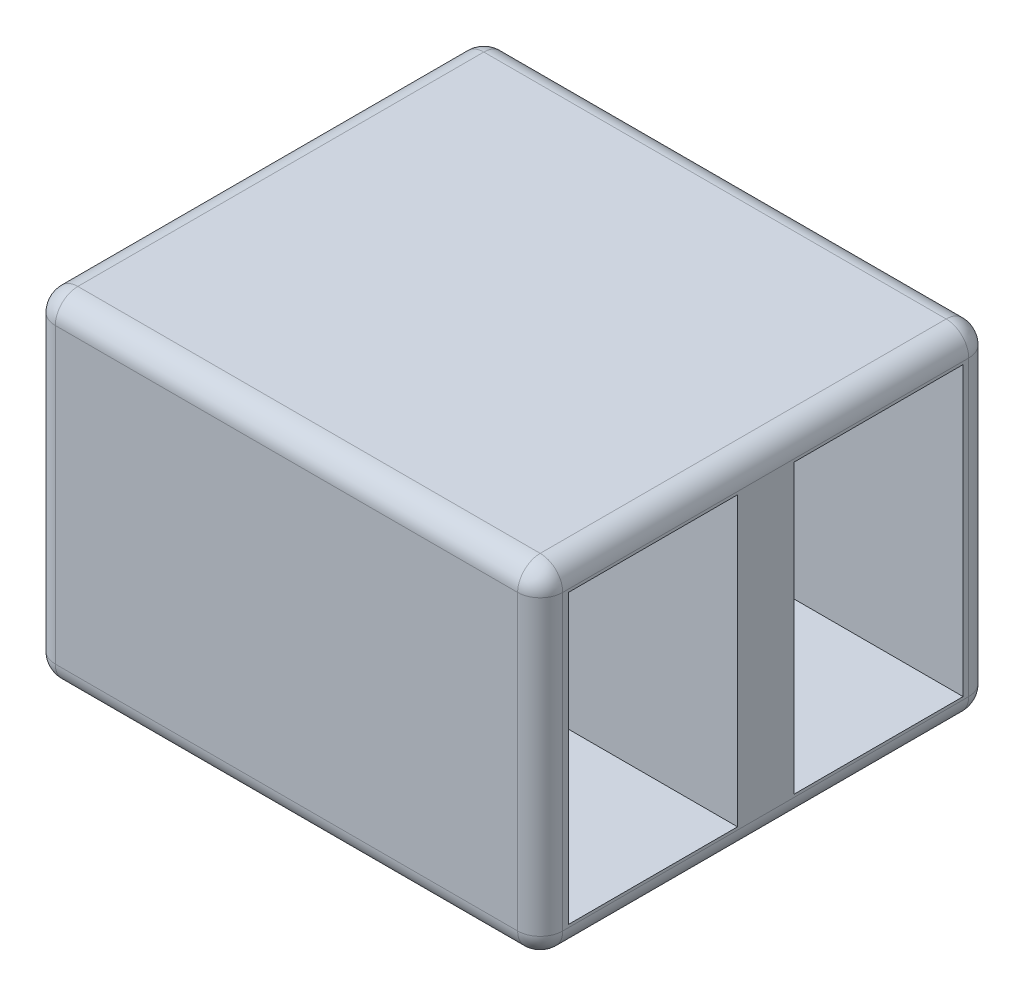
ISO-10303-21;
HEADER;
FILE_DESCRIPTION(('STEP AP214'),'2;1');
FILE_NAME('part.step','',(''),(''),'','','');
FILE_SCHEMA(('AUTOMOTIVE_DESIGN { 1 0 10303 214 1 1 1 1 }'));
ENDSEC;
DATA;
#1=APPLICATION_CONTEXT('core data for automotive mechanical design processes');
#2=APPLICATION_PROTOCOL_DEFINITION('international standard','automotive_design',2000,#1);
#3=PRODUCT_CONTEXT('',#1,'mechanical');
#4=PRODUCT('Part','Part','',(#3));
#5=PRODUCT_RELATED_PRODUCT_CATEGORY('part','',(#4));
#6=PRODUCT_DEFINITION_FORMATION('','',#4);
#7=PRODUCT_DEFINITION_CONTEXT('part definition',#1,'design');
#8=PRODUCT_DEFINITION('design','',#6,#7);
#9=PRODUCT_DEFINITION_SHAPE('','',#8);
#10=(LENGTH_UNIT() NAMED_UNIT(*) SI_UNIT(.MILLI.,.METRE.));
#11=(NAMED_UNIT(*) PLANE_ANGLE_UNIT() SI_UNIT($,.RADIAN.));
#12=(NAMED_UNIT(*) SI_UNIT($,.STERADIAN.) SOLID_ANGLE_UNIT());
#13=UNCERTAINTY_MEASURE_WITH_UNIT(LENGTH_MEASURE(1.E-05),#10,'distance_accuracy_value','');
#14=(GEOMETRIC_REPRESENTATION_CONTEXT(3) GLOBAL_UNCERTAINTY_ASSIGNED_CONTEXT((#13)) GLOBAL_UNIT_ASSIGNED_CONTEXT((#10,
#11,#12)) REPRESENTATION_CONTEXT('',''));
#15=CARTESIAN_POINT('',(0.,0.,0.));
#16=DIRECTION('',(0.,0.,1.));
#17=DIRECTION('',(1.,0.,0.));
#18=AXIS2_PLACEMENT_3D('',#15,#16,#17);
#19=CARTESIAN_POINT('',(22.5,-15.,20.));
#20=DIRECTION('',(1.,0.,0.));
#21=DIRECTION('',(0.,0.,-1.));
#22=AXIS2_PLACEMENT_3D('',#19,#20,#21);
#23=PLANE('',#22);
#24=DIRECTION('',(0.,1.,0.));
#25=VECTOR('',#24,1.);
#26=CARTESIAN_POINT('',(22.5,-15.,18.));
#27=LINE('',#26,#25);
#28=CARTESIAN_POINT('',(22.5,13.,18.));
#29=VERTEX_POINT('',#28);
#30=CARTESIAN_POINT('',(22.5,-13.,18.));
#31=VERTEX_POINT('',#30);
#32=EDGE_CURVE('E53',#29,#31,#27,.F.);
#33=ORIENTED_EDGE('',*,*,#32,.T.);
#34=DIRECTION('',(0.,0.,-1.));
#35=VECTOR('',#34,1.);
#36=CARTESIAN_POINT('',(22.5,-13.,-20.));
#37=LINE('',#36,#35);
#38=CARTESIAN_POINT('',(22.5,-13.,-18.));
#39=VERTEX_POINT('',#38);
#40=EDGE_CURVE('E11',#31,#39,#37,.T.);
#41=ORIENTED_EDGE('',*,*,#40,.T.);
#42=DIRECTION('',(0.,1.,0.));
#43=VECTOR('',#42,1.);
#44=CARTESIAN_POINT('',(22.5,15.,-18.));
#45=LINE('',#44,#43);
#46=CARTESIAN_POINT('',(22.5,13.,-18.));
#47=VERTEX_POINT('',#46);
#48=EDGE_CURVE('E42',#39,#47,#45,.T.);
#49=ORIENTED_EDGE('',*,*,#48,.T.);
#50=DIRECTION('',(0.,0.,-1.));
#51=VECTOR('',#50,1.);
#52=CARTESIAN_POINT('',(22.5,13.,20.));
#53=LINE('',#52,#51);
#54=EDGE_CURVE('E317',#47,#29,#53,.F.);
#55=ORIENTED_EDGE('',*,*,#54,.T.);
#56=EDGE_LOOP('',(#33,#41,#49,#55));
#57=FACE_BOUND('',#56,.T.);
#58=DIRECTION('',(0.,-1.,0.));
#59=VECTOR('',#58,1.);
#60=CARTESIAN_POINT('',(22.5,12.75,17.5));
#61=LINE('',#60,#59);
#62=CARTESIAN_POINT('',(22.5,12.75,17.5));
#63=VERTEX_POINT('',#62);
#64=CARTESIAN_POINT('',(22.5,-12.75,17.5));
#65=VERTEX_POINT('',#64);
#66=EDGE_CURVE('E200',#63,#65,#61,.T.);
#67=ORIENTED_EDGE('',*,*,#66,.F.);
#68=DIRECTION('',(0.,0.,-1.));
#69=VECTOR('',#68,1.);
#70=CARTESIAN_POINT('',(22.5,12.75,17.5));
#71=LINE('',#70,#69);
#72=CARTESIAN_POINT('',(22.5,12.75,2.5));
#73=VERTEX_POINT('',#72);
#74=EDGE_CURVE('E231',#63,#73,#71,.T.);
#75=ORIENTED_EDGE('',*,*,#74,.T.);
#76=DIRECTION('',(0.,-1.,0.));
#77=VECTOR('',#76,1.);
#78=CARTESIAN_POINT('',(22.5,12.75,2.5));
#79=LINE('',#78,#77);
#80=CARTESIAN_POINT('',(22.5,-12.75,2.5));
#81=VERTEX_POINT('',#80);
#82=EDGE_CURVE('E237',#73,#81,#79,.T.);
#83=ORIENTED_EDGE('',*,*,#82,.T.);
#84=DIRECTION('',(0.,0.,-1.));
#85=VECTOR('',#84,1.);
#86=CARTESIAN_POINT('',(22.5,-12.75,17.5));
#87=LINE('',#86,#85);
#88=EDGE_CURVE('E222',#65,#81,#87,.T.);
#89=ORIENTED_EDGE('',*,*,#88,.F.);
#90=EDGE_LOOP('',(#67,#75,#83,#89));
#91=FACE_BOUND('',#90,.T.);
#92=DIRECTION('',(0.,-1.,0.));
#93=VECTOR('',#92,1.);
#94=CARTESIAN_POINT('',(22.5,12.75,-2.5));
#95=LINE('',#94,#93);
#96=CARTESIAN_POINT('',(22.5,12.75,-2.5));
#97=VERTEX_POINT('',#96);
#98=CARTESIAN_POINT('',(22.5,-12.75,-2.5));
#99=VERTEX_POINT('',#98);
#100=EDGE_CURVE('E213',#97,#99,#95,.T.);
#101=ORIENTED_EDGE('',*,*,#100,.F.);
#102=DIRECTION('',(0.,0.,-1.));
#103=VECTOR('',#102,1.);
#104=CARTESIAN_POINT('',(22.5,12.75,-17.5));
#105=LINE('',#104,#103);
#106=CARTESIAN_POINT('',(22.5,12.75,-17.5));
#107=VERTEX_POINT('',#106);
#108=EDGE_CURVE('E205',#97,#107,#105,.T.);
#109=ORIENTED_EDGE('',*,*,#108,.T.);
#110=DIRECTION('',(0.,-1.,0.));
#111=VECTOR('',#110,1.);
#112=CARTESIAN_POINT('',(22.5,12.75,-17.5));
#113=LINE('',#112,#111);
#114=CARTESIAN_POINT('',(22.5,-12.75,-17.5));
#115=VERTEX_POINT('',#114);
#116=EDGE_CURVE('E216',#107,#115,#113,.T.);
#117=ORIENTED_EDGE('',*,*,#116,.T.);
#118=DIRECTION('',(0.,0.,-1.));
#119=VECTOR('',#118,1.);
#120=CARTESIAN_POINT('',(22.5,-12.75,-17.5));
#121=LINE('',#120,#119);
#122=EDGE_CURVE('E196',#99,#115,#121,.T.);
#123=ORIENTED_EDGE('',*,*,#122,.F.);
#124=EDGE_LOOP('',(#101,#109,#117,#123));
#125=FACE_BOUND('',#124,.T.);
#126=ADVANCED_FACE('F33',(#57,#91,#125),#23,.T.);
#127=CARTESIAN_POINT('',(-22.5,-15.,20.));
#128=DIRECTION('',(0.,0.,1.));
#129=DIRECTION('',(1.,0.,0.));
#130=AXIS2_PLACEMENT_3D('',#127,#128,#129);
#131=PLANE('',#130);
#132=DIRECTION('',(0.,1.,0.));
#133=VECTOR('',#132,1.);
#134=CARTESIAN_POINT('',(-20.5,-15.,20.));
#135=LINE('',#134,#133);
#136=CARTESIAN_POINT('',(-20.5,13.,20.));
#137=VERTEX_POINT('',#136);
#138=CARTESIAN_POINT('',(-20.5,-13.,20.));
#139=VERTEX_POINT('',#138);
#140=EDGE_CURVE('E312',#137,#139,#135,.F.);
#141=ORIENTED_EDGE('',*,*,#140,.T.);
#142=DIRECTION('',(1.,0.,0.));
#143=VECTOR('',#142,1.);
#144=CARTESIAN_POINT('',(22.5,-13.,20.));
#145=LINE('',#144,#143);
#146=CARTESIAN_POINT('',(20.5,-13.,20.));
#147=VERTEX_POINT('',#146);
#148=EDGE_CURVE('E315',#139,#147,#145,.T.);
#149=ORIENTED_EDGE('',*,*,#148,.T.);
#150=DIRECTION('',(0.,1.,0.));
#151=VECTOR('',#150,1.);
#152=CARTESIAN_POINT('',(20.5,-15.,20.));
#153=LINE('',#152,#151);
#154=CARTESIAN_POINT('',(20.5,13.,20.));
#155=VERTEX_POINT('',#154);
#156=EDGE_CURVE('E310',#147,#155,#153,.T.);
#157=ORIENTED_EDGE('',*,*,#156,.T.);
#158=DIRECTION('',(1.,0.,0.));
#159=VECTOR('',#158,1.);
#160=CARTESIAN_POINT('',(-22.5,13.,20.));
#161=LINE('',#160,#159);
#162=EDGE_CURVE('E308',#155,#137,#161,.F.);
#163=ORIENTED_EDGE('',*,*,#162,.T.);
#164=EDGE_LOOP('',(#141,#149,#157,#163));
#165=FACE_BOUND('',#164,.T.);
#166=ADVANCED_FACE('F399',(#165),#131,.T.);
#167=CARTESIAN_POINT('',(-22.5,-15.,20.));
#168=DIRECTION('',(1.,0.,0.));
#169=DIRECTION('',(0.,0.,-1.));
#170=AXIS2_PLACEMENT_3D('',#167,#168,#169);
#171=PLANE('',#170);
#172=CARTESIAN_POINT('',(-22.5,0.,0.));
#173=DIRECTION('',(1.,0.,0.));
#174=DIRECTION('',(0.,0.,-1.));
#175=AXIS2_PLACEMENT_3D('',#172,#173,#174);
#176=CIRCLE('',#175,5.);
#177=CARTESIAN_POINT('',(-22.5,0.,-5.));
#178=VERTEX_POINT('',#177);
#179=EDGE_CURVE('E189',#178,#178,#176,.T.);
#180=ORIENTED_EDGE('',*,*,#179,.T.);
#181=EDGE_LOOP('',(#180));
#182=FACE_BOUND('',#181,.T.);
#183=DIRECTION('',(0.,1.,0.));
#184=VECTOR('',#183,1.);
#185=CARTESIAN_POINT('',(-22.5,-15.,-18.));
#186=LINE('',#185,#184);
#187=CARTESIAN_POINT('',(-22.5,13.,-18.));
#188=VERTEX_POINT('',#187);
#189=CARTESIAN_POINT('',(-22.5,-13.,-18.));
#190=VERTEX_POINT('',#189);
#191=EDGE_CURVE('E285',#188,#190,#186,.F.);
#192=ORIENTED_EDGE('',*,*,#191,.T.);
#193=DIRECTION('',(0.,0.,-1.));
#194=VECTOR('',#193,1.);
#195=CARTESIAN_POINT('',(-22.5,-13.,20.));
#196=LINE('',#195,#194);
#197=CARTESIAN_POINT('',(-22.5,-13.,18.));
#198=VERTEX_POINT('',#197);
#199=EDGE_CURVE('E287',#190,#198,#196,.F.);
#200=ORIENTED_EDGE('',*,*,#199,.T.);
#201=DIRECTION('',(0.,1.,0.));
#202=VECTOR('',#201,1.);
#203=CARTESIAN_POINT('',(-22.5,15.,18.));
#204=LINE('',#203,#202);
#205=CARTESIAN_POINT('',(-22.5,13.,18.));
#206=VERTEX_POINT('',#205);
#207=EDGE_CURVE('E281',#198,#206,#204,.T.);
#208=ORIENTED_EDGE('',*,*,#207,.T.);
#209=DIRECTION('',(0.,0.,-1.));
#210=VECTOR('',#209,1.);
#211=CARTESIAN_POINT('',(-22.5,13.,-20.));
#212=LINE('',#211,#210);
#213=EDGE_CURVE('E283',#206,#188,#212,.T.);
#214=ORIENTED_EDGE('',*,*,#213,.T.);
#215=EDGE_LOOP('',(#192,#200,#208,#214));
#216=FACE_BOUND('',#215,.T.);
#217=ADVANCED_FACE('F481',(#182,#216),#171,.F.);
#218=CARTESIAN_POINT('',(-22.5,-15.,-20.));
#219=DIRECTION('',(0.,0.,1.));
#220=DIRECTION('',(1.,0.,0.));
#221=AXIS2_PLACEMENT_3D('',#218,#219,#220);
#222=PLANE('',#221);
#223=DIRECTION('',(0.,1.,0.));
#224=VECTOR('',#223,1.);
#225=CARTESIAN_POINT('',(20.5,-15.,-20.));
#226=LINE('',#225,#224);
#227=CARTESIAN_POINT('',(20.5,13.,-20.));
#228=VERTEX_POINT('',#227);
#229=CARTESIAN_POINT('',(20.5,-13.,-20.));
#230=VERTEX_POINT('',#229);
#231=EDGE_CURVE('E292',#228,#230,#226,.F.);
#232=ORIENTED_EDGE('',*,*,#231,.T.);
#233=DIRECTION('',(1.,0.,0.));
#234=VECTOR('',#233,1.);
#235=CARTESIAN_POINT('',(-22.5,-13.,-20.));
#236=LINE('',#235,#234);
#237=CARTESIAN_POINT('',(-20.5,-13.,-20.));
#238=VERTEX_POINT('',#237);
#239=EDGE_CURVE('E297',#230,#238,#236,.F.);
#240=ORIENTED_EDGE('',*,*,#239,.T.);
#241=DIRECTION('',(0.,1.,0.));
#242=VECTOR('',#241,1.);
#243=CARTESIAN_POINT('',(-20.5,-15.,-20.));
#244=LINE('',#243,#242);
#245=CARTESIAN_POINT('',(-20.5,13.,-20.));
#246=VERTEX_POINT('',#245);
#247=EDGE_CURVE('E294',#238,#246,#244,.T.);
#248=ORIENTED_EDGE('',*,*,#247,.T.);
#249=DIRECTION('',(1.,0.,0.));
#250=VECTOR('',#249,1.);
#251=CARTESIAN_POINT('',(22.5,13.,-20.));
#252=LINE('',#251,#250);
#253=EDGE_CURVE('E290',#246,#228,#252,.T.);
#254=ORIENTED_EDGE('',*,*,#253,.T.);
#255=EDGE_LOOP('',(#232,#240,#248,#254));
#256=FACE_BOUND('',#255,.T.);
#257=ADVANCED_FACE('F459',(#256),#222,.F.);
#258=CARTESIAN_POINT('',(0.,-15.,0.));
#259=DIRECTION('',(0.,1.,0.));
#260=DIRECTION('',(0.,0.,1.));
#261=AXIS2_PLACEMENT_3D('',#258,#259,#260);
#262=PLANE('',#261);
#263=DIRECTION('',(1.,0.,0.));
#264=VECTOR('',#263,1.);
#265=CARTESIAN_POINT('',(-22.5,-15.,18.));
#266=LINE('',#265,#264);
#267=CARTESIAN_POINT('',(20.5,-15.,18.));
#268=VERTEX_POINT('',#267);
#269=CARTESIAN_POINT('',(-20.5,-15.,18.));
#270=VERTEX_POINT('',#269);
#271=EDGE_CURVE('E276',#268,#270,#266,.F.);
#272=ORIENTED_EDGE('',*,*,#271,.T.);
#273=DIRECTION('',(0.,0.,-1.));
#274=VECTOR('',#273,1.);
#275=CARTESIAN_POINT('',(-20.5,-15.,0.));
#276=LINE('',#275,#274);
#277=CARTESIAN_POINT('',(-20.5,-15.,-18.));
#278=VERTEX_POINT('',#277);
#279=EDGE_CURVE('E278',#270,#278,#276,.T.);
#280=ORIENTED_EDGE('',*,*,#279,.T.);
#281=DIRECTION('',(1.,0.,0.));
#282=VECTOR('',#281,1.);
#283=CARTESIAN_POINT('',(0.,-15.,-18.));
#284=LINE('',#283,#282);
#285=CARTESIAN_POINT('',(20.5,-15.,-18.));
#286=VERTEX_POINT('',#285);
#287=EDGE_CURVE('E267',#278,#286,#284,.T.);
#288=ORIENTED_EDGE('',*,*,#287,.T.);
#289=DIRECTION('',(0.,0.,-1.));
#290=VECTOR('',#289,1.);
#291=CARTESIAN_POINT('',(20.5,-15.,20.));
#292=LINE('',#291,#290);
#293=EDGE_CURVE('E274',#286,#268,#292,.F.);
#294=ORIENTED_EDGE('',*,*,#293,.T.);
#295=EDGE_LOOP('',(#272,#280,#288,#294));
#296=FACE_BOUND('',#295,.T.);
#297=ADVANCED_FACE('F451',(#296),#262,.F.);
#298=CARTESIAN_POINT('',(0.,15.,0.));
#299=DIRECTION('',(0.,1.,0.));
#300=DIRECTION('',(0.,0.,1.));
#301=AXIS2_PLACEMENT_3D('',#298,#299,#300);
#302=PLANE('',#301);
#303=DIRECTION('',(1.,0.,0.));
#304=VECTOR('',#303,1.);
#305=CARTESIAN_POINT('',(-22.5,15.,-18.));
#306=LINE('',#305,#304);
#307=CARTESIAN_POINT('',(20.5,15.,-18.));
#308=VERTEX_POINT('',#307);
#309=CARTESIAN_POINT('',(-20.5,15.,-18.));
#310=VERTEX_POINT('',#309);
#311=EDGE_CURVE('E303',#308,#310,#306,.F.);
#312=ORIENTED_EDGE('',*,*,#311,.T.);
#313=DIRECTION('',(0.,0.,-1.));
#314=VECTOR('',#313,1.);
#315=CARTESIAN_POINT('',(-20.5,15.,20.));
#316=LINE('',#315,#314);
#317=CARTESIAN_POINT('',(-20.5,15.,18.));
#318=VERTEX_POINT('',#317);
#319=EDGE_CURVE('E305',#310,#318,#316,.F.);
#320=ORIENTED_EDGE('',*,*,#319,.T.);
#321=DIRECTION('',(1.,0.,0.));
#322=VECTOR('',#321,1.);
#323=CARTESIAN_POINT('',(0.,15.,18.));
#324=LINE('',#323,#322);
#325=CARTESIAN_POINT('',(20.5,15.,18.));
#326=VERTEX_POINT('',#325);
#327=EDGE_CURVE('E301',#318,#326,#324,.T.);
#328=ORIENTED_EDGE('',*,*,#327,.T.);
#329=DIRECTION('',(0.,0.,-1.));
#330=VECTOR('',#329,1.);
#331=CARTESIAN_POINT('',(20.5,15.,0.));
#332=LINE('',#331,#330);
#333=EDGE_CURVE('E299',#326,#308,#332,.T.);
#334=ORIENTED_EDGE('',*,*,#333,.T.);
#335=EDGE_LOOP('',(#312,#320,#328,#334));
#336=FACE_BOUND('',#335,.T.);
#337=ADVANCED_FACE('F432',(#336),#302,.T.);
#338=CARTESIAN_POINT('',(22.5,12.75,17.5));
#339=DIRECTION('',(0.,0.,-1.));
#340=DIRECTION('',(-1.,0.,0.));
#341=AXIS2_PLACEMENT_3D('',#338,#339,#340);
#342=PLANE('',#341);
#343=CARTESIAN_POINT('',(-2.5,0.25,17.5));
#344=DIRECTION('',(0.,0.,-1.));
#345=DIRECTION('',(-1.,0.,0.));
#346=AXIS2_PLACEMENT_3D('',#343,#344,#345);
#347=CIRCLE('',#346,13.);
#348=CARTESIAN_POINT('',(-2.5,-12.75,17.5));
#349=VERTEX_POINT('',#348);
#350=CARTESIAN_POINT('',(-15.497595931556,0.,17.5));
#351=VERTEX_POINT('',#350);
#352=EDGE_CURVE('E254',#349,#351,#347,.T.);
#353=ORIENTED_EDGE('',*,*,#352,.T.);
#354=CARTESIAN_POINT('',(-2.5,-0.25,17.5));
#355=DIRECTION('',(0.,0.,-1.));
#356=DIRECTION('',(-1.,0.,0.));
#357=AXIS2_PLACEMENT_3D('',#354,#355,#356);
#358=CIRCLE('',#357,13.);
#359=CARTESIAN_POINT('',(-2.5,12.75,17.5));
#360=VERTEX_POINT('',#359);
#361=EDGE_CURVE('E256',#351,#360,#358,.T.);
#362=ORIENTED_EDGE('',*,*,#361,.T.);
#363=DIRECTION('',(1.,0.,0.));
#364=VECTOR('',#363,1.);
#365=CARTESIAN_POINT('',(22.5,12.75,17.5));
#366=LINE('',#365,#364);
#367=EDGE_CURVE('E229',#360,#63,#366,.T.);
#368=ORIENTED_EDGE('',*,*,#367,.T.);
#369=ORIENTED_EDGE('',*,*,#66,.T.);
#370=DIRECTION('',(1.,0.,0.));
#371=VECTOR('',#370,1.);
#372=CARTESIAN_POINT('',(22.5,-12.75,17.5));
#373=LINE('',#372,#371);
#374=EDGE_CURVE('E220',#349,#65,#373,.T.);
#375=ORIENTED_EDGE('',*,*,#374,.F.);
#376=EDGE_LOOP('',(#353,#362,#368,#369,#375));
#377=FACE_BOUND('',#376,.T.);
#378=ADVANCED_FACE('F580',(#377),#342,.T.);
#379=CARTESIAN_POINT('',(22.5,12.75,2.5));
#380=DIRECTION('',(0.,0.,1.));
#381=DIRECTION('',(1.,0.,0.));
#382=AXIS2_PLACEMENT_3D('',#379,#380,#381);
#383=PLANE('',#382);
#384=DIRECTION('',(-1.,0.,0.));
#385=VECTOR('',#384,1.);
#386=CARTESIAN_POINT('',(22.5,12.75,2.5));
#387=LINE('',#386,#385);
#388=CARTESIAN_POINT('',(-2.5,12.75,2.5));
#389=VERTEX_POINT('',#388);
#390=EDGE_CURVE('E234',#73,#389,#387,.T.);
#391=ORIENTED_EDGE('',*,*,#390,.T.);
#392=CARTESIAN_POINT('',(-2.5,-0.25,2.5));
#393=DIRECTION('',(0.,0.,1.));
#394=DIRECTION('',(1.,0.,0.));
#395=AXIS2_PLACEMENT_3D('',#392,#393,#394);
#396=CIRCLE('',#395,13.);
#397=CARTESIAN_POINT('',(-15.497595931556,0.,2.5));
#398=VERTEX_POINT('',#397);
#399=EDGE_CURVE('E263',#389,#398,#396,.T.);
#400=ORIENTED_EDGE('',*,*,#399,.T.);
#401=CARTESIAN_POINT('',(-2.5,0.25,2.5));
#402=DIRECTION('',(0.,0.,1.));
#403=DIRECTION('',(1.,0.,0.));
#404=AXIS2_PLACEMENT_3D('',#401,#402,#403);
#405=CIRCLE('',#404,13.);
#406=CARTESIAN_POINT('',(-2.5,-12.75,2.5));
#407=VERTEX_POINT('',#406);
#408=EDGE_CURVE('E261',#398,#407,#405,.T.);
#409=ORIENTED_EDGE('',*,*,#408,.T.);
#410=DIRECTION('',(-1.,0.,0.));
#411=VECTOR('',#410,1.);
#412=CARTESIAN_POINT('',(22.5,-12.75,2.5));
#413=LINE('',#412,#411);
#414=EDGE_CURVE('E226',#81,#407,#413,.T.);
#415=ORIENTED_EDGE('',*,*,#414,.F.);
#416=ORIENTED_EDGE('',*,*,#82,.F.);
#417=EDGE_LOOP('',(#391,#400,#409,#415,#416));
#418=FACE_BOUND('',#417,.T.);
#419=ADVANCED_FACE('F590',(#418),#383,.T.);
#420=CARTESIAN_POINT('',(0.,12.75,0.));
#421=DIRECTION('',(0.,-1.,0.));
#422=DIRECTION('',(0.,0.,-1.));
#423=AXIS2_PLACEMENT_3D('',#420,#421,#422);
#424=PLANE('',#423);
#425=ORIENTED_EDGE('',*,*,#367,.F.);
#426=DIRECTION('',(0.,0.,1.));
#427=VECTOR('',#426,1.);
#428=CARTESIAN_POINT('',(-2.5,12.75,2.5));
#429=LINE('',#428,#427);
#430=EDGE_CURVE('E258',#360,#389,#429,.F.);
#431=ORIENTED_EDGE('',*,*,#430,.T.);
#432=ORIENTED_EDGE('',*,*,#390,.F.);
#433=ORIENTED_EDGE('',*,*,#74,.F.);
#434=EDGE_LOOP('',(#425,#431,#432,#433));
#435=FACE_BOUND('',#434,.T.);
#436=ADVANCED_FACE('F598',(#435),#424,.T.);
#437=CARTESIAN_POINT('',(0.,-12.75,0.));
#438=DIRECTION('',(0.,-1.,0.));
#439=DIRECTION('',(0.,0.,-1.));
#440=AXIS2_PLACEMENT_3D('',#437,#438,#439);
#441=PLANE('',#440);
#442=ORIENTED_EDGE('',*,*,#414,.T.);
#443=DIRECTION('',(0.,0.,1.));
#444=VECTOR('',#443,1.);
#445=CARTESIAN_POINT('',(-2.5,-12.75,0.));
#446=LINE('',#445,#444);
#447=EDGE_CURVE('E265',#407,#349,#446,.T.);
#448=ORIENTED_EDGE('',*,*,#447,.T.);
#449=ORIENTED_EDGE('',*,*,#374,.T.);
#450=ORIENTED_EDGE('',*,*,#88,.T.);
#451=EDGE_LOOP('',(#442,#448,#449,#450));
#452=FACE_BOUND('',#451,.T.);
#453=ADVANCED_FACE('F606',(#452),#441,.F.);
#454=CARTESIAN_POINT('',(22.5,12.75,-17.5));
#455=DIRECTION('',(0.,0.,1.));
#456=DIRECTION('',(1.,0.,0.));
#457=AXIS2_PLACEMENT_3D('',#454,#455,#456);
#458=PLANE('',#457);
#459=CARTESIAN_POINT('',(-2.5,-0.25,-17.5));
#460=DIRECTION('',(0.,0.,1.));
#461=DIRECTION('',(1.,0.,0.));
#462=AXIS2_PLACEMENT_3D('',#459,#460,#461);
#463=CIRCLE('',#462,13.);
#464=CARTESIAN_POINT('',(-2.5,12.75,-17.5));
#465=VERTEX_POINT('',#464);
#466=CARTESIAN_POINT('',(-15.497595931556,0.,-17.5));
#467=VERTEX_POINT('',#466);
#468=EDGE_CURVE('E248',#465,#467,#463,.T.);
#469=ORIENTED_EDGE('',*,*,#468,.T.);
#470=CARTESIAN_POINT('',(-2.5,0.25,-17.5));
#471=DIRECTION('',(0.,0.,1.));
#472=DIRECTION('',(1.,0.,0.));
#473=AXIS2_PLACEMENT_3D('',#470,#471,#472);
#474=CIRCLE('',#473,13.);
#475=CARTESIAN_POINT('',(-2.5,-12.75,-17.5));
#476=VERTEX_POINT('',#475);
#477=EDGE_CURVE('E250',#467,#476,#474,.T.);
#478=ORIENTED_EDGE('',*,*,#477,.T.);
#479=DIRECTION('',(-1.,0.,0.));
#480=VECTOR('',#479,1.);
#481=CARTESIAN_POINT('',(22.5,-12.75,-17.5));
#482=LINE('',#481,#480);
#483=EDGE_CURVE('E199',#115,#476,#482,.T.);
#484=ORIENTED_EDGE('',*,*,#483,.F.);
#485=ORIENTED_EDGE('',*,*,#116,.F.);
#486=DIRECTION('',(-1.,0.,0.));
#487=VECTOR('',#486,1.);
#488=CARTESIAN_POINT('',(22.5,12.75,-17.5));
#489=LINE('',#488,#487);
#490=EDGE_CURVE('E208',#107,#465,#489,.T.);
#491=ORIENTED_EDGE('',*,*,#490,.T.);
#492=EDGE_LOOP('',(#469,#478,#484,#485,#491));
#493=FACE_BOUND('',#492,.T.);
#494=ADVANCED_FACE('F614',(#493),#458,.T.);
#495=CARTESIAN_POINT('',(22.5,12.75,-2.5));
#496=DIRECTION('',(0.,0.,-1.));
#497=DIRECTION('',(-1.,0.,0.));
#498=AXIS2_PLACEMENT_3D('',#495,#496,#497);
#499=PLANE('',#498);
#500=DIRECTION('',(1.,0.,0.));
#501=VECTOR('',#500,1.);
#502=CARTESIAN_POINT('',(22.5,-12.75,-2.5));
#503=LINE('',#502,#501);
#504=CARTESIAN_POINT('',(-2.5,-12.75,-2.5));
#505=VERTEX_POINT('',#504);
#506=EDGE_CURVE('E203',#505,#99,#503,.T.);
#507=ORIENTED_EDGE('',*,*,#506,.F.);
#508=CARTESIAN_POINT('',(-2.5,0.25,-2.5));
#509=DIRECTION('',(0.,0.,-1.));
#510=DIRECTION('',(-1.,0.,0.));
#511=AXIS2_PLACEMENT_3D('',#508,#509,#510);
#512=CIRCLE('',#511,13.);
#513=CARTESIAN_POINT('',(-15.497595931556,0.,-2.5));
#514=VERTEX_POINT('',#513);
#515=EDGE_CURVE('E246',#505,#514,#512,.T.);
#516=ORIENTED_EDGE('',*,*,#515,.T.);
#517=CARTESIAN_POINT('',(-2.5,-0.25,-2.5));
#518=DIRECTION('',(0.,0.,-1.));
#519=DIRECTION('',(-1.,0.,0.));
#520=AXIS2_PLACEMENT_3D('',#517,#518,#519);
#521=CIRCLE('',#520,13.);
#522=CARTESIAN_POINT('',(-2.5,12.75,-2.5));
#523=VERTEX_POINT('',#522);
#524=EDGE_CURVE('E244',#514,#523,#521,.T.);
#525=ORIENTED_EDGE('',*,*,#524,.T.);
#526=DIRECTION('',(1.,0.,0.));
#527=VECTOR('',#526,1.);
#528=CARTESIAN_POINT('',(22.5,12.75,-2.5));
#529=LINE('',#528,#527);
#530=EDGE_CURVE('E211',#523,#97,#529,.T.);
#531=ORIENTED_EDGE('',*,*,#530,.T.);
#532=ORIENTED_EDGE('',*,*,#100,.T.);
#533=EDGE_LOOP('',(#507,#516,#525,#531,#532));
#534=FACE_BOUND('',#533,.T.);
#535=ADVANCED_FACE('F622',(#534),#499,.T.);
#536=CARTESIAN_POINT('',(0.,12.75,0.));
#537=DIRECTION('',(0.,-1.,0.));
#538=DIRECTION('',(0.,0.,-1.));
#539=AXIS2_PLACEMENT_3D('',#536,#537,#538);
#540=PLANE('',#539);
#541=ORIENTED_EDGE('',*,*,#530,.F.);
#542=DIRECTION('',(0.,0.,1.));
#543=VECTOR('',#542,1.);
#544=CARTESIAN_POINT('',(-2.5,12.75,-17.5));
#545=LINE('',#544,#543);
#546=EDGE_CURVE('E252',#523,#465,#545,.F.);
#547=ORIENTED_EDGE('',*,*,#546,.T.);
#548=ORIENTED_EDGE('',*,*,#490,.F.);
#549=ORIENTED_EDGE('',*,*,#108,.F.);
#550=EDGE_LOOP('',(#541,#547,#548,#549));
#551=FACE_BOUND('',#550,.T.);
#552=ADVANCED_FACE('F630',(#551),#540,.T.);
#553=CARTESIAN_POINT('',(0.,-12.75,0.));
#554=DIRECTION('',(0.,-1.,0.));
#555=DIRECTION('',(0.,0.,-1.));
#556=AXIS2_PLACEMENT_3D('',#553,#554,#555);
#557=PLANE('',#556);
#558=ORIENTED_EDGE('',*,*,#483,.T.);
#559=DIRECTION('',(0.,0.,1.));
#560=VECTOR('',#559,1.);
#561=CARTESIAN_POINT('',(-2.5,-12.75,0.));
#562=LINE('',#561,#560);
#563=EDGE_CURVE('E219',#476,#505,#562,.T.);
#564=ORIENTED_EDGE('',*,*,#563,.T.);
#565=ORIENTED_EDGE('',*,*,#506,.T.);
#566=ORIENTED_EDGE('',*,*,#122,.T.);
#567=EDGE_LOOP('',(#558,#564,#565,#566));
#568=FACE_BOUND('',#567,.T.);
#569=ADVANCED_FACE('F494',(#568),#557,.F.);
#570=CARTESIAN_POINT('',(-2.5,-0.25,-17.5));
#571=DIRECTION('',(0.,0.,-1.));
#572=DIRECTION('',(-1.,0.,0.));
#573=AXIS2_PLACEMENT_3D('',#570,#571,#572);
#574=CYLINDRICAL_SURFACE('',#573,13.);
#575=DIRECTION('',(0.,0.,-1.));
#576=VECTOR('',#575,1.);
#577=CARTESIAN_POINT('',(-15.497595931556,0.,-10.));
#578=LINE('',#577,#576);
#579=EDGE_CURVE('E223',#467,#514,#578,.F.);
#580=ORIENTED_EDGE('',*,*,#579,.F.);
#581=ORIENTED_EDGE('',*,*,#468,.F.);
#582=ORIENTED_EDGE('',*,*,#546,.F.);
#583=ORIENTED_EDGE('',*,*,#524,.F.);
#584=EDGE_LOOP('',(#580,#581,#582,#583));
#585=FACE_BOUND('',#584,.T.);
#586=ADVANCED_FACE('F490',(#585),#574,.F.);
#587=CARTESIAN_POINT('',(-2.5,0.25,0.));
#588=DIRECTION('',(0.,0.,1.));
#589=DIRECTION('',(1.,0.,0.));
#590=AXIS2_PLACEMENT_3D('',#587,#588,#589);
#591=CYLINDRICAL_SURFACE('',#590,13.);
#592=ORIENTED_EDGE('',*,*,#477,.F.);
#593=ORIENTED_EDGE('',*,*,#579,.T.);
#594=ORIENTED_EDGE('',*,*,#515,.F.);
#595=ORIENTED_EDGE('',*,*,#563,.F.);
#596=EDGE_LOOP('',(#592,#593,#594,#595));
#597=FACE_BOUND('',#596,.T.);
#598=ADVANCED_FACE('F486',(#597),#591,.F.);
#599=CARTESIAN_POINT('',(-2.5,0.25,0.));
#600=DIRECTION('',(0.,0.,1.));
#601=DIRECTION('',(1.,0.,0.));
#602=AXIS2_PLACEMENT_3D('',#599,#600,#601);
#603=CYLINDRICAL_SURFACE('',#602,13.);
#604=ORIENTED_EDGE('',*,*,#447,.F.);
#605=ORIENTED_EDGE('',*,*,#408,.F.);
#606=DIRECTION('',(0.,0.,1.));
#607=VECTOR('',#606,1.);
#608=CARTESIAN_POINT('',(-15.497595931556,0.,9.99999999999999));
#609=LINE('',#608,#607);
#610=EDGE_CURVE('E270',#351,#398,#609,.F.);
#611=ORIENTED_EDGE('',*,*,#610,.F.);
#612=ORIENTED_EDGE('',*,*,#352,.F.);
#613=EDGE_LOOP('',(#604,#605,#611,#612));
#614=FACE_BOUND('',#613,.T.);
#615=ADVANCED_FACE('F489',(#614),#603,.F.);
#616=CARTESIAN_POINT('',(-2.5,-0.25,17.5));
#617=DIRECTION('',(0.,0.,-1.));
#618=DIRECTION('',(-1.,0.,0.));
#619=AXIS2_PLACEMENT_3D('',#616,#617,#618);
#620=CYLINDRICAL_SURFACE('',#619,13.);
#621=ORIENTED_EDGE('',*,*,#399,.F.);
#622=ORIENTED_EDGE('',*,*,#430,.F.);
#623=ORIENTED_EDGE('',*,*,#361,.F.);
#624=ORIENTED_EDGE('',*,*,#610,.T.);
#625=EDGE_LOOP('',(#621,#622,#623,#624));
#626=FACE_BOUND('',#625,.T.);
#627=ADVANCED_FACE('F496',(#626),#620,.F.);
#628=CARTESIAN_POINT('',(20.5,13.,0.));
#629=DIRECTION('',(0.,0.,-1.));
#630=DIRECTION('',(-1.,0.,0.));
#631=AXIS2_PLACEMENT_3D('',#628,#629,#630);
#632=CYLINDRICAL_SURFACE('',#631,2.);
#633=CARTESIAN_POINT('',(20.5,13.,18.));
#634=DIRECTION('',(0.,0.,1.));
#635=DIRECTION('',(1.,0.,0.));
#636=AXIS2_PLACEMENT_3D('',#633,#634,#635);
#637=CIRCLE('',#636,2.);
#638=EDGE_CURVE('E37',#29,#326,#637,.T.);
#639=ORIENTED_EDGE('',*,*,#638,.F.);
#640=ORIENTED_EDGE('',*,*,#54,.F.);
#641=CARTESIAN_POINT('',(20.5,13.,-18.));
#642=DIRECTION('',(0.,0.,-1.));
#643=DIRECTION('',(-1.,0.,0.));
#644=AXIS2_PLACEMENT_3D('',#641,#642,#643);
#645=CIRCLE('',#644,2.);
#646=EDGE_CURVE('E377',#308,#47,#645,.T.);
#647=ORIENTED_EDGE('',*,*,#646,.F.);
#648=ORIENTED_EDGE('',*,*,#333,.F.);
#649=EDGE_LOOP('',(#639,#640,#647,#648));
#650=FACE_BOUND('',#649,.T.);
#651=ADVANCED_FACE('F35',(#650),#632,.T.);
#652=CARTESIAN_POINT('',(20.5,13.,18.));
#653=DIRECTION('',(0.,0.,1.));
#654=DIRECTION('',(1.,0.,0.));
#655=AXIS2_PLACEMENT_3D('',#652,#653,#654);
#656=SPHERICAL_SURFACE('',#655,2.);
#657=CARTESIAN_POINT('',(20.5,13.,18.));
#658=DIRECTION('',(0.,1.,0.));
#659=DIRECTION('',(0.,0.,1.));
#660=AXIS2_PLACEMENT_3D('',#657,#658,#659);
#661=CIRCLE('',#660,2.);
#662=EDGE_CURVE('E372',#29,#155,#661,.F.);
#663=ORIENTED_EDGE('',*,*,#662,.F.);
#664=ORIENTED_EDGE('',*,*,#638,.T.);
#665=CARTESIAN_POINT('',(20.5,13.,18.));
#666=DIRECTION('',(1.,0.,0.));
#667=DIRECTION('',(0.,0.,-1.));
#668=AXIS2_PLACEMENT_3D('',#665,#666,#667);
#669=CIRCLE('',#668,2.);
#670=EDGE_CURVE('E375',#155,#326,#669,.F.);
#671=ORIENTED_EDGE('',*,*,#670,.F.);
#672=EDGE_LOOP('',(#663,#664,#671));
#673=FACE_BOUND('',#672,.T.);
#674=ADVANCED_FACE('F389',(#673),#656,.T.);
#675=CARTESIAN_POINT('',(20.5,13.,-18.));
#676=DIRECTION('',(0.,0.,1.));
#677=DIRECTION('',(1.,0.,0.));
#678=AXIS2_PLACEMENT_3D('',#675,#676,#677);
#679=SPHERICAL_SURFACE('',#678,2.);
#680=CARTESIAN_POINT('',(20.5,13.,-18.));
#681=DIRECTION('',(1.,0.,0.));
#682=DIRECTION('',(0.,0.,-1.));
#683=AXIS2_PLACEMENT_3D('',#680,#681,#682);
#684=CIRCLE('',#683,2.);
#685=EDGE_CURVE('E367',#308,#228,#684,.F.);
#686=ORIENTED_EDGE('',*,*,#685,.F.);
#687=ORIENTED_EDGE('',*,*,#646,.T.);
#688=CARTESIAN_POINT('',(20.5,13.,-18.));
#689=DIRECTION('',(0.,1.,0.));
#690=DIRECTION('',(0.,0.,1.));
#691=AXIS2_PLACEMENT_3D('',#688,#689,#690);
#692=CIRCLE('',#691,2.);
#693=EDGE_CURVE('E370',#228,#47,#692,.F.);
#694=ORIENTED_EDGE('',*,*,#693,.F.);
#695=EDGE_LOOP('',(#686,#687,#694));
#696=FACE_BOUND('',#695,.T.);
#697=ADVANCED_FACE('F425',(#696),#679,.T.);
#698=CARTESIAN_POINT('',(0.,13.,18.));
#699=DIRECTION('',(1.,0.,0.));
#700=DIRECTION('',(0.,0.,-1.));
#701=AXIS2_PLACEMENT_3D('',#698,#699,#700);
#702=CYLINDRICAL_SURFACE('',#701,2.);
#703=ORIENTED_EDGE('',*,*,#670,.T.);
#704=ORIENTED_EDGE('',*,*,#327,.F.);
#705=CARTESIAN_POINT('',(-20.5,13.,18.));
#706=DIRECTION('',(-1.,0.,0.));
#707=DIRECTION('',(0.,0.,1.));
#708=AXIS2_PLACEMENT_3D('',#705,#706,#707);
#709=CIRCLE('',#708,2.);
#710=EDGE_CURVE('E362',#137,#318,#709,.T.);
#711=ORIENTED_EDGE('',*,*,#710,.F.);
#712=ORIENTED_EDGE('',*,*,#162,.F.);
#713=EDGE_LOOP('',(#703,#704,#711,#712));
#714=FACE_BOUND('',#713,.T.);
#715=ADVANCED_FACE('F395',(#714),#702,.T.);
#716=CARTESIAN_POINT('',(20.5,-15.,18.));
#717=DIRECTION('',(0.,1.,0.));
#718=DIRECTION('',(0.,0.,1.));
#719=AXIS2_PLACEMENT_3D('',#716,#717,#718);
#720=CYLINDRICAL_SURFACE('',#719,2.);
#721=ORIENTED_EDGE('',*,*,#662,.T.);
#722=ORIENTED_EDGE('',*,*,#156,.F.);
#723=CARTESIAN_POINT('',(20.5,-13.,18.));
#724=DIRECTION('',(0.,-1.,0.));
#725=DIRECTION('',(0.,0.,-1.));
#726=AXIS2_PLACEMENT_3D('',#723,#724,#725);
#727=CIRCLE('',#726,2.);
#728=EDGE_CURVE('E359',#31,#147,#727,.T.);
#729=ORIENTED_EDGE('',*,*,#728,.F.);
#730=ORIENTED_EDGE('',*,*,#32,.F.);
#731=EDGE_LOOP('',(#721,#722,#729,#730));
#732=FACE_BOUND('',#731,.T.);
#733=ADVANCED_FACE('F405',(#732),#720,.T.);
#734=CARTESIAN_POINT('',(20.5,-13.,20.));
#735=DIRECTION('',(0.,0.,1.));
#736=DIRECTION('',(1.,0.,0.));
#737=AXIS2_PLACEMENT_3D('',#734,#735,#736);
#738=CYLINDRICAL_SURFACE('',#737,2.);
#739=CARTESIAN_POINT('',(20.5,-13.,-18.));
#740=DIRECTION('',(0.,0.,-1.));
#741=DIRECTION('',(0.,1.,0.));
#742=AXIS2_PLACEMENT_3D('',#739,#740,#741);
#743=CIRCLE('',#742,2.);
#744=EDGE_CURVE('E353',#39,#286,#743,.T.);
#745=ORIENTED_EDGE('',*,*,#744,.F.);
#746=ORIENTED_EDGE('',*,*,#40,.F.);
#747=CARTESIAN_POINT('',(20.5,-13.,18.));
#748=DIRECTION('',(0.,0.,1.));
#749=DIRECTION('',(1.,0.,0.));
#750=AXIS2_PLACEMENT_3D('',#747,#748,#749);
#751=CIRCLE('',#750,2.);
#752=EDGE_CURVE('E356',#268,#31,#751,.T.);
#753=ORIENTED_EDGE('',*,*,#752,.F.);
#754=ORIENTED_EDGE('',*,*,#293,.F.);
#755=EDGE_LOOP('',(#745,#746,#753,#754));
#756=FACE_BOUND('',#755,.T.);
#757=ADVANCED_FACE('F414',(#756),#738,.T.);
#758=CARTESIAN_POINT('',(20.5,-15.,-18.));
#759=DIRECTION('',(0.,-1.,0.));
#760=DIRECTION('',(0.,0.,-1.));
#761=AXIS2_PLACEMENT_3D('',#758,#759,#760);
#762=CYLINDRICAL_SURFACE('',#761,2.);
#763=ORIENTED_EDGE('',*,*,#693,.T.);
#764=ORIENTED_EDGE('',*,*,#48,.F.);
#765=CARTESIAN_POINT('',(20.5,-13.,-18.));
#766=DIRECTION('',(0.,-1.,0.));
#767=DIRECTION('',(0.,0.,-1.));
#768=AXIS2_PLACEMENT_3D('',#765,#766,#767);
#769=CIRCLE('',#768,2.);
#770=EDGE_CURVE('E350',#230,#39,#769,.T.);
#771=ORIENTED_EDGE('',*,*,#770,.F.);
#772=ORIENTED_EDGE('',*,*,#231,.F.);
#773=EDGE_LOOP('',(#763,#764,#771,#772));
#774=FACE_BOUND('',#773,.T.);
#775=ADVANCED_FACE('F422',(#774),#762,.T.);
#776=CARTESIAN_POINT('',(-22.5,13.,-18.));
#777=DIRECTION('',(-1.,0.,0.));
#778=DIRECTION('',(0.,0.,1.));
#779=AXIS2_PLACEMENT_3D('',#776,#777,#778);
#780=CYLINDRICAL_SURFACE('',#779,2.);
#781=ORIENTED_EDGE('',*,*,#685,.T.);
#782=ORIENTED_EDGE('',*,*,#253,.F.);
#783=CARTESIAN_POINT('',(-20.5,13.,-18.));
#784=DIRECTION('',(-1.,0.,0.));
#785=DIRECTION('',(0.,0.,1.));
#786=AXIS2_PLACEMENT_3D('',#783,#784,#785);
#787=CIRCLE('',#786,2.);
#788=EDGE_CURVE('E347',#310,#246,#787,.T.);
#789=ORIENTED_EDGE('',*,*,#788,.F.);
#790=ORIENTED_EDGE('',*,*,#311,.F.);
#791=EDGE_LOOP('',(#781,#782,#789,#790));
#792=FACE_BOUND('',#791,.T.);
#793=ADVANCED_FACE('F429',(#792),#780,.T.);
#794=CARTESIAN_POINT('',(-20.5,13.,20.));
#795=DIRECTION('',(0.,0.,1.));
#796=DIRECTION('',(1.,0.,0.));
#797=AXIS2_PLACEMENT_3D('',#794,#795,#796);
#798=CYLINDRICAL_SURFACE('',#797,2.);
#799=CARTESIAN_POINT('',(-20.5,13.,18.));
#800=DIRECTION('',(0.,0.,1.));
#801=DIRECTION('',(1.,0.,0.));
#802=AXIS2_PLACEMENT_3D('',#799,#800,#801);
#803=CIRCLE('',#802,2.);
#804=EDGE_CURVE('E364',#318,#206,#803,.T.);
#805=ORIENTED_EDGE('',*,*,#804,.F.);
#806=ORIENTED_EDGE('',*,*,#319,.F.);
#807=CARTESIAN_POINT('',(-20.5,13.,-18.));
#808=DIRECTION('',(0.,0.,-1.));
#809=DIRECTION('',(-1.,0.,0.));
#810=AXIS2_PLACEMENT_3D('',#807,#808,#809);
#811=CIRCLE('',#810,2.);
#812=EDGE_CURVE('E344',#188,#310,#811,.T.);
#813=ORIENTED_EDGE('',*,*,#812,.F.);
#814=ORIENTED_EDGE('',*,*,#213,.F.);
#815=EDGE_LOOP('',(#805,#806,#813,#814));
#816=FACE_BOUND('',#815,.T.);
#817=ADVANCED_FACE('F436',(#816),#798,.T.);
#818=CARTESIAN_POINT('',(-20.5,13.,18.));
#819=DIRECTION('',(0.,0.,1.));
#820=DIRECTION('',(1.,0.,0.));
#821=AXIS2_PLACEMENT_3D('',#818,#819,#820);
#822=SPHERICAL_SURFACE('',#821,2.);
#823=ORIENTED_EDGE('',*,*,#710,.T.);
#824=ORIENTED_EDGE('',*,*,#804,.T.);
#825=CARTESIAN_POINT('',(-20.5,13.,18.));
#826=DIRECTION('',(0.,1.,0.));
#827=DIRECTION('',(0.,0.,1.));
#828=AXIS2_PLACEMENT_3D('',#825,#826,#827);
#829=CIRCLE('',#828,2.);
#830=EDGE_CURVE('E341',#137,#206,#829,.F.);
#831=ORIENTED_EDGE('',*,*,#830,.F.);
#832=EDGE_LOOP('',(#823,#824,#831));
#833=FACE_BOUND('',#832,.T.);
#834=ADVANCED_FACE('F440',(#833),#822,.T.);
#835=CARTESIAN_POINT('',(20.5,-13.,18.));
#836=DIRECTION('',(0.,0.,1.));
#837=DIRECTION('',(1.,0.,0.));
#838=AXIS2_PLACEMENT_3D('',#835,#836,#837);
#839=SPHERICAL_SURFACE('',#838,2.);
#840=ORIENTED_EDGE('',*,*,#752,.T.);
#841=ORIENTED_EDGE('',*,*,#728,.T.);
#842=CARTESIAN_POINT('',(20.5,-13.,18.));
#843=DIRECTION('',(1.,0.,0.));
#844=DIRECTION('',(0.,0.,-1.));
#845=AXIS2_PLACEMENT_3D('',#842,#843,#844);
#846=CIRCLE('',#845,2.);
#847=EDGE_CURVE('E338',#268,#147,#846,.F.);
#848=ORIENTED_EDGE('',*,*,#847,.F.);
#849=EDGE_LOOP('',(#840,#841,#848));
#850=FACE_BOUND('',#849,.T.);
#851=ADVANCED_FACE('F409',(#850),#839,.T.);
#852=CARTESIAN_POINT('',(20.5,-13.,-18.));
#853=DIRECTION('',(0.,0.,1.));
#854=DIRECTION('',(1.,0.,0.));
#855=AXIS2_PLACEMENT_3D('',#852,#853,#854);
#856=SPHERICAL_SURFACE('',#855,2.);
#857=ORIENTED_EDGE('',*,*,#770,.T.);
#858=ORIENTED_EDGE('',*,*,#744,.T.);
#859=CARTESIAN_POINT('',(20.5,-13.,-18.));
#860=DIRECTION('',(1.,0.,0.));
#861=DIRECTION('',(0.,0.,-1.));
#862=AXIS2_PLACEMENT_3D('',#859,#860,#861);
#863=CIRCLE('',#862,2.);
#864=EDGE_CURVE('E335',#230,#286,#863,.F.);
#865=ORIENTED_EDGE('',*,*,#864,.F.);
#866=EDGE_LOOP('',(#857,#858,#865));
#867=FACE_BOUND('',#866,.T.);
#868=ADVANCED_FACE('F418',(#867),#856,.T.);
#869=CARTESIAN_POINT('',(-20.5,13.,-18.));
#870=DIRECTION('',(0.,0.,1.));
#871=DIRECTION('',(1.,0.,0.));
#872=AXIS2_PLACEMENT_3D('',#869,#870,#871);
#873=SPHERICAL_SURFACE('',#872,2.);
#874=ORIENTED_EDGE('',*,*,#812,.T.);
#875=ORIENTED_EDGE('',*,*,#788,.T.);
#876=CARTESIAN_POINT('',(-20.5,13.,-18.));
#877=DIRECTION('',(0.,1.,0.));
#878=DIRECTION('',(0.,0.,1.));
#879=AXIS2_PLACEMENT_3D('',#876,#877,#878);
#880=CIRCLE('',#879,2.);
#881=EDGE_CURVE('E333',#188,#246,#880,.F.);
#882=ORIENTED_EDGE('',*,*,#881,.F.);
#883=EDGE_LOOP('',(#874,#875,#882));
#884=FACE_BOUND('',#883,.T.);
#885=ADVANCED_FACE('F466',(#884),#873,.T.);
#886=CARTESIAN_POINT('',(-20.5,-15.,18.));
#887=DIRECTION('',(0.,-1.,0.));
#888=DIRECTION('',(0.,0.,-1.));
#889=AXIS2_PLACEMENT_3D('',#886,#887,#888);
#890=CYLINDRICAL_SURFACE('',#889,2.);
#891=ORIENTED_EDGE('',*,*,#830,.T.);
#892=ORIENTED_EDGE('',*,*,#207,.F.);
#893=CARTESIAN_POINT('',(-20.5,-13.,18.));
#894=DIRECTION('',(0.,-1.,0.));
#895=DIRECTION('',(0.,0.,-1.));
#896=AXIS2_PLACEMENT_3D('',#893,#894,#895);
#897=CIRCLE('',#896,2.);
#898=EDGE_CURVE('E330',#139,#198,#897,.T.);
#899=ORIENTED_EDGE('',*,*,#898,.F.);
#900=ORIENTED_EDGE('',*,*,#140,.F.);
#901=EDGE_LOOP('',(#891,#892,#899,#900));
#902=FACE_BOUND('',#901,.T.);
#903=ADVANCED_FACE('F443',(#902),#890,.T.);
#904=CARTESIAN_POINT('',(-22.5,-13.,18.));
#905=DIRECTION('',(-1.,0.,0.));
#906=DIRECTION('',(0.,0.,1.));
#907=AXIS2_PLACEMENT_3D('',#904,#905,#906);
#908=CYLINDRICAL_SURFACE('',#907,2.);
#909=ORIENTED_EDGE('',*,*,#847,.T.);
#910=ORIENTED_EDGE('',*,*,#148,.F.);
#911=CARTESIAN_POINT('',(-20.5,-13.,18.));
#912=DIRECTION('',(-1.,0.,0.));
#913=DIRECTION('',(0.,0.,1.));
#914=AXIS2_PLACEMENT_3D('',#911,#912,#913);
#915=CIRCLE('',#914,2.);
#916=EDGE_CURVE('E328',#270,#139,#915,.T.);
#917=ORIENTED_EDGE('',*,*,#916,.F.);
#918=ORIENTED_EDGE('',*,*,#271,.F.);
#919=EDGE_LOOP('',(#909,#910,#917,#918));
#920=FACE_BOUND('',#919,.T.);
#921=ADVANCED_FACE('F449',(#920),#908,.T.);
#922=CARTESIAN_POINT('',(0.,-13.,-18.));
#923=DIRECTION('',(1.,0.,0.));
#924=DIRECTION('',(0.,0.,-1.));
#925=AXIS2_PLACEMENT_3D('',#922,#923,#924);
#926=CYLINDRICAL_SURFACE('',#925,2.);
#927=ORIENTED_EDGE('',*,*,#864,.T.);
#928=ORIENTED_EDGE('',*,*,#287,.F.);
#929=CARTESIAN_POINT('',(-20.5,-13.,-18.));
#930=DIRECTION('',(-1.,0.,0.));
#931=DIRECTION('',(0.,0.,1.));
#932=AXIS2_PLACEMENT_3D('',#929,#930,#931);
#933=CIRCLE('',#932,2.);
#934=EDGE_CURVE('E325',#238,#278,#933,.T.);
#935=ORIENTED_EDGE('',*,*,#934,.F.);
#936=ORIENTED_EDGE('',*,*,#239,.F.);
#937=EDGE_LOOP('',(#927,#928,#935,#936));
#938=FACE_BOUND('',#937,.T.);
#939=ADVANCED_FACE('F456',(#938),#926,.T.);
#940=CARTESIAN_POINT('',(-20.5,-15.,-18.));
#941=DIRECTION('',(0.,1.,0.));
#942=DIRECTION('',(0.,0.,1.));
#943=AXIS2_PLACEMENT_3D('',#940,#941,#942);
#944=CYLINDRICAL_SURFACE('',#943,2.);
#945=ORIENTED_EDGE('',*,*,#881,.T.);
#946=ORIENTED_EDGE('',*,*,#247,.F.);
#947=CARTESIAN_POINT('',(-20.5,-13.,-18.));
#948=DIRECTION('',(0.,-1.,0.));
#949=DIRECTION('',(0.,0.,-1.));
#950=AXIS2_PLACEMENT_3D('',#947,#948,#949);
#951=CIRCLE('',#950,2.);
#952=EDGE_CURVE('E322',#190,#238,#951,.T.);
#953=ORIENTED_EDGE('',*,*,#952,.F.);
#954=ORIENTED_EDGE('',*,*,#191,.F.);
#955=EDGE_LOOP('',(#945,#946,#953,#954));
#956=FACE_BOUND('',#955,.T.);
#957=ADVANCED_FACE('F462',(#956),#944,.T.);
#958=CARTESIAN_POINT('',(-20.5,-13.,18.));
#959=DIRECTION('',(0.,0.,1.));
#960=DIRECTION('',(1.,0.,0.));
#961=AXIS2_PLACEMENT_3D('',#958,#959,#960);
#962=SPHERICAL_SURFACE('',#961,2.);
#963=ORIENTED_EDGE('',*,*,#916,.T.);
#964=ORIENTED_EDGE('',*,*,#898,.T.);
#965=CARTESIAN_POINT('',(-20.5,-13.,18.));
#966=DIRECTION('',(0.,0.,1.));
#967=DIRECTION('',(1.,0.,0.));
#968=AXIS2_PLACEMENT_3D('',#965,#966,#967);
#969=CIRCLE('',#968,2.);
#970=EDGE_CURVE('E193',#270,#198,#969,.F.);
#971=ORIENTED_EDGE('',*,*,#970,.F.);
#972=EDGE_LOOP('',(#963,#964,#971));
#973=FACE_BOUND('',#972,.T.);
#974=ADVANCED_FACE('F509',(#973),#962,.T.);
#975=CARTESIAN_POINT('',(-20.5,-13.,-18.));
#976=DIRECTION('',(0.,0.,1.));
#977=DIRECTION('',(1.,0.,0.));
#978=AXIS2_PLACEMENT_3D('',#975,#976,#977);
#979=SPHERICAL_SURFACE('',#978,2.);
#980=ORIENTED_EDGE('',*,*,#952,.T.);
#981=ORIENTED_EDGE('',*,*,#934,.T.);
#982=CARTESIAN_POINT('',(-20.5,-13.,-18.));
#983=DIRECTION('',(0.,0.,-1.));
#984=DIRECTION('',(-1.,0.,0.));
#985=AXIS2_PLACEMENT_3D('',#982,#983,#984);
#986=CIRCLE('',#985,2.);
#987=EDGE_CURVE('E191',#190,#278,#986,.F.);
#988=ORIENTED_EDGE('',*,*,#987,.F.);
#989=EDGE_LOOP('',(#980,#981,#988));
#990=FACE_BOUND('',#989,.T.);
#991=ADVANCED_FACE('F505',(#990),#979,.T.);
#992=CARTESIAN_POINT('',(-20.5,-13.,0.));
#993=DIRECTION('',(0.,0.,-1.));
#994=DIRECTION('',(-1.,0.,0.));
#995=AXIS2_PLACEMENT_3D('',#992,#993,#994);
#996=CYLINDRICAL_SURFACE('',#995,2.);
#997=ORIENTED_EDGE('',*,*,#970,.T.);
#998=ORIENTED_EDGE('',*,*,#199,.F.);
#999=ORIENTED_EDGE('',*,*,#987,.T.);
#1000=ORIENTED_EDGE('',*,*,#279,.F.);
#1001=EDGE_LOOP('',(#997,#998,#999,#1000));
#1002=FACE_BOUND('',#1001,.T.);
#1003=ADVANCED_FACE('F185',(#1002),#996,.T.);
#1004=CARTESIAN_POINT('',(-22.5,0.,0.));
#1005=DIRECTION('',(1.,0.,0.));
#1006=DIRECTION('',(0.,0.,-1.));
#1007=AXIS2_PLACEMENT_3D('',#1004,#1005,#1006);
#1008=CONICAL_SURFACE('',#1007,5.,0.463647609000806);
#1009=CARTESIAN_POINT('',(-32.5,0.,0.));
#1010=VERTEX_POINT('',#1009);
#1011=VERTEX_LOOP('',#1010);
#1012=FACE_BOUND('',#1011,.T.);
#1013=ORIENTED_EDGE('',*,*,#179,.F.);
#1014=EDGE_LOOP('',(#1013));
#1015=FACE_BOUND('',#1014,.T.);
#1016=ADVANCED_FACE('F182',(#1012,#1015),#1008,.T.);
#1017=CLOSED_SHELL('',(#126,#166,#217,#257,#297,#337,#378,#419,#436,#453,#494,#535,#552,#569,
#586,#598,#615,#627,#651,#674,#697,#715,#733,#757,#775,#793,#817,#834,#851,#868,#885,#903,#921,
#939,#957,#974,#991,#1003,#1016));
#1018=MANIFOLD_SOLID_BREP('B2',#1017);
#1019=ADVANCED_BREP_SHAPE_REPRESENTATION('',(#18,#1018),#14);
#1020=SHAPE_DEFINITION_REPRESENTATION(#9,#1019);
ENDSEC;
END-ISO-10303-21;
